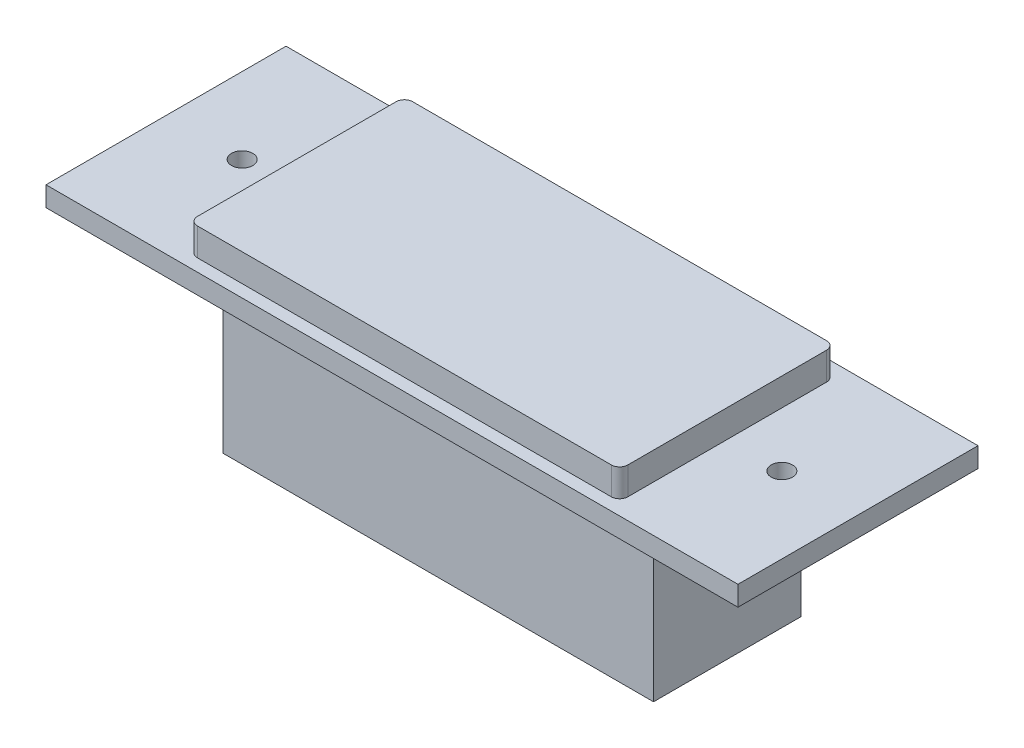
ISO-10303-21;
HEADER;
FILE_DESCRIPTION(('STEP AP214'),'2;1');
FILE_NAME('part.step','',(''),(''),'','','');
FILE_SCHEMA(('AUTOMOTIVE_DESIGN { 1 0 10303 214 1 1 1 1 }'));
ENDSEC;
DATA;
#1=APPLICATION_CONTEXT('core data for automotive mechanical design processes');
#2=APPLICATION_PROTOCOL_DEFINITION('international standard','automotive_design',2000,#1);
#3=PRODUCT_CONTEXT('',#1,'mechanical');
#4=PRODUCT('Part','Part','',(#3));
#5=PRODUCT_RELATED_PRODUCT_CATEGORY('part','',(#4));
#6=PRODUCT_DEFINITION_FORMATION('','',#4);
#7=PRODUCT_DEFINITION_CONTEXT('part definition',#1,'design');
#8=PRODUCT_DEFINITION('design','',#6,#7);
#9=PRODUCT_DEFINITION_SHAPE('','',#8);
#10=(LENGTH_UNIT() NAMED_UNIT(*) SI_UNIT(.MILLI.,.METRE.));
#11=(NAMED_UNIT(*) PLANE_ANGLE_UNIT() SI_UNIT($,.RADIAN.));
#12=(NAMED_UNIT(*) SI_UNIT($,.STERADIAN.) SOLID_ANGLE_UNIT());
#13=UNCERTAINTY_MEASURE_WITH_UNIT(LENGTH_MEASURE(1.E-05),#10,'distance_accuracy_value','');
#14=(GEOMETRIC_REPRESENTATION_CONTEXT(3) GLOBAL_UNCERTAINTY_ASSIGNED_CONTEXT((#13)) GLOBAL_UNIT_ASSIGNED_CONTEXT((#10,
#11,#12)) REPRESENTATION_CONTEXT('',''));
#15=CARTESIAN_POINT('',(0.,0.,0.));
#16=DIRECTION('',(0.,0.,1.));
#17=DIRECTION('',(1.,0.,0.));
#18=AXIS2_PLACEMENT_3D('',#15,#16,#17);
#19=CARTESIAN_POINT('',(0.,-3.048,0.));
#20=DIRECTION('',(0.,1.,0.));
#21=DIRECTION('',(0.,0.,1.));
#22=AXIS2_PLACEMENT_3D('',#19,#20,#21);
#23=PLANE('',#22);
#24=DIRECTION('',(0.,0.,-1.));
#25=VECTOR('',#24,1.);
#26=CARTESIAN_POINT('',(-53.086,-3.048,18.415));
#27=LINE('',#26,#25);
#28=CARTESIAN_POINT('',(-53.086,-3.048,18.415));
#29=VERTEX_POINT('',#28);
#30=CARTESIAN_POINT('',(-53.086,-3.048,-18.415));
#31=VERTEX_POINT('',#30);
#32=EDGE_CURVE('E191',#29,#31,#27,.T.);
#33=ORIENTED_EDGE('',*,*,#32,.T.);
#34=DIRECTION('',(1.,0.,0.));
#35=VECTOR('',#34,1.);
#36=CARTESIAN_POINT('',(53.086,-3.048,-18.415));
#37=LINE('',#36,#35);
#38=CARTESIAN_POINT('',(53.086,-3.048,-18.415));
#39=VERTEX_POINT('',#38);
#40=EDGE_CURVE('E194',#31,#39,#37,.T.);
#41=ORIENTED_EDGE('',*,*,#40,.T.);
#42=DIRECTION('',(0.,0.,1.));
#43=VECTOR('',#42,1.);
#44=CARTESIAN_POINT('',(53.086,-3.048,18.415));
#45=LINE('',#44,#43);
#46=CARTESIAN_POINT('',(53.086,-3.048,18.415));
#47=VERTEX_POINT('',#46);
#48=EDGE_CURVE('E197',#39,#47,#45,.T.);
#49=ORIENTED_EDGE('',*,*,#48,.T.);
#50=DIRECTION('',(-1.,0.,0.));
#51=VECTOR('',#50,1.);
#52=CARTESIAN_POINT('',(53.086,-3.048,18.415));
#53=LINE('',#52,#51);
#54=EDGE_CURVE('E199',#47,#29,#53,.T.);
#55=ORIENTED_EDGE('',*,*,#54,.T.);
#56=EDGE_LOOP('',(#33,#41,#49,#55));
#57=FACE_BOUND('',#56,.T.);
#58=CARTESIAN_POINT('',(41.402,-3.048,0.));
#59=DIRECTION('',(0.,1.,0.));
#60=DIRECTION('',(0.,0.,1.));
#61=AXIS2_PLACEMENT_3D('',#58,#59,#60);
#62=CIRCLE('',#61,1.63195);
#63=CARTESIAN_POINT('',(41.402,-3.048,1.63195));
#64=VERTEX_POINT('',#63);
#65=EDGE_CURVE('E187',#64,#64,#62,.T.);
#66=ORIENTED_EDGE('',*,*,#65,.T.);
#67=EDGE_LOOP('',(#66));
#68=FACE_BOUND('',#67,.T.);
#69=CARTESIAN_POINT('',(-41.402,-3.048,0.));
#70=DIRECTION('',(0.,1.,0.));
#71=DIRECTION('',(0.,0.,1.));
#72=AXIS2_PLACEMENT_3D('',#69,#70,#71);
#73=CIRCLE('',#72,1.63194999999999);
#74=CARTESIAN_POINT('',(-41.402,-3.048,1.63194999999999));
#75=VERTEX_POINT('',#74);
#76=EDGE_CURVE('E176',#75,#75,#73,.T.);
#77=ORIENTED_EDGE('',*,*,#76,.T.);
#78=EDGE_LOOP('',(#77));
#79=FACE_BOUND('',#78,.T.);
#80=DIRECTION('',(0.,0.,-1.));
#81=VECTOR('',#80,1.);
#82=CARTESIAN_POINT('',(-33.02,-3.048,11.303));
#83=LINE('',#82,#81);
#84=CARTESIAN_POINT('',(-33.02,-3.048,11.303));
#85=VERTEX_POINT('',#84);
#86=CARTESIAN_POINT('',(-33.02,-3.048,-11.303));
#87=VERTEX_POINT('',#86);
#88=EDGE_CURVE('E172',#85,#87,#83,.T.);
#89=ORIENTED_EDGE('',*,*,#88,.F.);
#90=DIRECTION('',(-1.,0.,0.));
#91=VECTOR('',#90,1.);
#92=CARTESIAN_POINT('',(33.02,-3.048,11.303));
#93=LINE('',#92,#91);
#94=CARTESIAN_POINT('',(33.02,-3.048,11.303));
#95=VERTEX_POINT('',#94);
#96=EDGE_CURVE('E169',#95,#85,#93,.T.);
#97=ORIENTED_EDGE('',*,*,#96,.F.);
#98=DIRECTION('',(0.,0.,1.));
#99=VECTOR('',#98,1.);
#100=CARTESIAN_POINT('',(33.02,-3.048,11.303));
#101=LINE('',#100,#99);
#102=CARTESIAN_POINT('',(33.02,-3.048,-11.303));
#103=VERTEX_POINT('',#102);
#104=EDGE_CURVE('E59',#103,#95,#101,.T.);
#105=ORIENTED_EDGE('',*,*,#104,.F.);
#106=DIRECTION('',(1.,0.,0.));
#107=VECTOR('',#106,1.);
#108=CARTESIAN_POINT('',(33.02,-3.048,-11.303));
#109=LINE('',#108,#107);
#110=EDGE_CURVE('E54',#87,#103,#109,.T.);
#111=ORIENTED_EDGE('',*,*,#110,.F.);
#112=EDGE_LOOP('',(#89,#97,#105,#111));
#113=FACE_BOUND('',#112,.T.);
#114=ADVANCED_FACE('F39',(#57,#68,#79,#113),#23,.F.);
#115=CARTESIAN_POINT('',(33.02,4.2418,-16.51));
#116=DIRECTION('',(-1.,0.,0.));
#117=DIRECTION('',(0.,0.,1.));
#118=AXIS2_PLACEMENT_3D('',#115,#116,#117);
#119=PLANE('',#118);
#120=DIRECTION('',(0.,0.,-1.));
#121=VECTOR('',#120,1.);
#122=CARTESIAN_POINT('',(33.02,4.2418,-16.51));
#123=LINE('',#122,#121);
#124=CARTESIAN_POINT('',(33.02,4.2418,15.24));
#125=VERTEX_POINT('',#124);
#126=CARTESIAN_POINT('',(33.02,4.2418,-15.24));
#127=VERTEX_POINT('',#126);
#128=EDGE_CURVE('E221',#125,#127,#123,.T.);
#129=ORIENTED_EDGE('',*,*,#128,.F.);
#130=DIRECTION('',(0.,-1.,0.));
#131=VECTOR('',#130,1.);
#132=CARTESIAN_POINT('',(33.02,4.2418,15.24));
#133=LINE('',#132,#131);
#134=CARTESIAN_POINT('',(33.02,0.,15.24));
#135=VERTEX_POINT('',#134);
#136=EDGE_CURVE('E243',#125,#135,#133,.T.);
#137=ORIENTED_EDGE('',*,*,#136,.T.);
#138=DIRECTION('',(0.,0.,-1.));
#139=VECTOR('',#138,1.);
#140=CARTESIAN_POINT('',(33.02,0.,-16.51));
#141=LINE('',#140,#139);
#142=CARTESIAN_POINT('',(33.02,0.,-15.24));
#143=VERTEX_POINT('',#142);
#144=EDGE_CURVE('E220',#135,#143,#141,.T.);
#145=ORIENTED_EDGE('',*,*,#144,.T.);
#146=DIRECTION('',(0.,-1.,0.));
#147=VECTOR('',#146,1.);
#148=CARTESIAN_POINT('',(33.02,4.2418,-15.24));
#149=LINE('',#148,#147);
#150=EDGE_CURVE('E234',#143,#127,#149,.F.);
#151=ORIENTED_EDGE('',*,*,#150,.T.);
#152=EDGE_LOOP('',(#129,#137,#145,#151));
#153=FACE_BOUND('',#152,.T.);
#154=ADVANCED_FACE('F301',(#153),#119,.F.);
#155=CARTESIAN_POINT('',(-33.02,4.2418,-16.51));
#156=DIRECTION('',(0.,0.,1.));
#157=DIRECTION('',(1.,0.,0.));
#158=AXIS2_PLACEMENT_3D('',#155,#156,#157);
#159=PLANE('',#158);
#160=DIRECTION('',(-1.,0.,0.));
#161=VECTOR('',#160,1.);
#162=CARTESIAN_POINT('',(-33.02,4.2418,-16.51));
#163=LINE('',#162,#161);
#164=CARTESIAN_POINT('',(31.75,4.2418,-16.51));
#165=VERTEX_POINT('',#164);
#166=CARTESIAN_POINT('',(-31.75,4.2418,-16.51));
#167=VERTEX_POINT('',#166);
#168=EDGE_CURVE('E224',#165,#167,#163,.T.);
#169=ORIENTED_EDGE('',*,*,#168,.F.);
#170=DIRECTION('',(0.,-1.,0.));
#171=VECTOR('',#170,1.);
#172=CARTESIAN_POINT('',(31.75,4.2418,-16.51));
#173=LINE('',#172,#171);
#174=CARTESIAN_POINT('',(31.75,0.,-16.51));
#175=VERTEX_POINT('',#174);
#176=EDGE_CURVE('E273',#165,#175,#173,.T.);
#177=ORIENTED_EDGE('',*,*,#176,.T.);
#178=DIRECTION('',(-1.,0.,0.));
#179=VECTOR('',#178,1.);
#180=CARTESIAN_POINT('',(-33.02,0.,-16.51));
#181=LINE('',#180,#179);
#182=CARTESIAN_POINT('',(-31.75,0.,-16.51));
#183=VERTEX_POINT('',#182);
#184=EDGE_CURVE('E237',#175,#183,#181,.T.);
#185=ORIENTED_EDGE('',*,*,#184,.T.);
#186=DIRECTION('',(0.,-1.,0.));
#187=VECTOR('',#186,1.);
#188=CARTESIAN_POINT('',(-31.75,4.2418,-16.51));
#189=LINE('',#188,#187);
#190=EDGE_CURVE('E271',#183,#167,#189,.F.);
#191=ORIENTED_EDGE('',*,*,#190,.T.);
#192=EDGE_LOOP('',(#169,#177,#185,#191));
#193=FACE_BOUND('',#192,.T.);
#194=ADVANCED_FACE('F309',(#193),#159,.F.);
#195=CARTESIAN_POINT('',(-33.02,4.2418,-16.51));
#196=DIRECTION('',(1.,0.,0.));
#197=DIRECTION('',(0.,0.,-1.));
#198=AXIS2_PLACEMENT_3D('',#195,#196,#197);
#199=PLANE('',#198);
#200=DIRECTION('',(0.,0.,1.));
#201=VECTOR('',#200,1.);
#202=CARTESIAN_POINT('',(-33.02,4.2418,-16.51));
#203=LINE('',#202,#201);
#204=CARTESIAN_POINT('',(-33.02,4.2418,-15.24));
#205=VERTEX_POINT('',#204);
#206=CARTESIAN_POINT('',(-33.02,4.2418,15.24));
#207=VERTEX_POINT('',#206);
#208=EDGE_CURVE('E228',#205,#207,#203,.T.);
#209=ORIENTED_EDGE('',*,*,#208,.F.);
#210=DIRECTION('',(0.,-1.,0.));
#211=VECTOR('',#210,1.);
#212=CARTESIAN_POINT('',(-33.02,4.2418,-15.24));
#213=LINE('',#212,#211);
#214=CARTESIAN_POINT('',(-33.02,0.,-15.24));
#215=VERTEX_POINT('',#214);
#216=EDGE_CURVE('E11',#205,#215,#213,.T.);
#217=ORIENTED_EDGE('',*,*,#216,.T.);
#218=DIRECTION('',(0.,0.,1.));
#219=VECTOR('',#218,1.);
#220=CARTESIAN_POINT('',(-33.02,0.,-16.51));
#221=LINE('',#220,#219);
#222=CARTESIAN_POINT('',(-33.02,0.,15.24));
#223=VERTEX_POINT('',#222);
#224=EDGE_CURVE('E239',#215,#223,#221,.T.);
#225=ORIENTED_EDGE('',*,*,#224,.T.);
#226=DIRECTION('',(0.,-1.,0.));
#227=VECTOR('',#226,1.);
#228=CARTESIAN_POINT('',(-33.02,4.2418,15.24));
#229=LINE('',#228,#227);
#230=EDGE_CURVE('E47',#223,#207,#229,.F.);
#231=ORIENTED_EDGE('',*,*,#230,.T.);
#232=EDGE_LOOP('',(#209,#217,#225,#231));
#233=FACE_BOUND('',#232,.T.);
#234=ADVANCED_FACE('F278',(#233),#199,.F.);
#235=CARTESIAN_POINT('',(-33.02,4.2418,16.51));
#236=DIRECTION('',(0.,0.,-1.));
#237=DIRECTION('',(-1.,0.,0.));
#238=AXIS2_PLACEMENT_3D('',#235,#236,#237);
#239=PLANE('',#238);
#240=DIRECTION('',(1.,0.,0.));
#241=VECTOR('',#240,1.);
#242=CARTESIAN_POINT('',(-33.02,0.,16.51));
#243=LINE('',#242,#241);
#244=CARTESIAN_POINT('',(-31.75,0.,16.51));
#245=VERTEX_POINT('',#244);
#246=CARTESIAN_POINT('',(31.75,0.,16.51));
#247=VERTEX_POINT('',#246);
#248=EDGE_CURVE('E225',#245,#247,#243,.T.);
#249=ORIENTED_EDGE('',*,*,#248,.T.);
#250=DIRECTION('',(0.,-1.,0.));
#251=VECTOR('',#250,1.);
#252=CARTESIAN_POINT('',(31.75,4.2418,16.51));
#253=LINE('',#252,#251);
#254=CARTESIAN_POINT('',(31.75,4.2418,16.51));
#255=VERTEX_POINT('',#254);
#256=EDGE_CURVE('E261',#247,#255,#253,.F.);
#257=ORIENTED_EDGE('',*,*,#256,.T.);
#258=DIRECTION('',(1.,0.,0.));
#259=VECTOR('',#258,1.);
#260=CARTESIAN_POINT('',(-33.02,4.2418,16.51));
#261=LINE('',#260,#259);
#262=CARTESIAN_POINT('',(-31.75,4.2418,16.51));
#263=VERTEX_POINT('',#262);
#264=EDGE_CURVE('E231',#263,#255,#261,.T.);
#265=ORIENTED_EDGE('',*,*,#264,.F.);
#266=DIRECTION('',(0.,-1.,0.));
#267=VECTOR('',#266,1.);
#268=CARTESIAN_POINT('',(-31.75,4.2418,16.51));
#269=LINE('',#268,#267);
#270=EDGE_CURVE('E258',#263,#245,#269,.T.);
#271=ORIENTED_EDGE('',*,*,#270,.T.);
#272=EDGE_LOOP('',(#249,#257,#265,#271));
#273=FACE_BOUND('',#272,.T.);
#274=ADVANCED_FACE('F290',(#273),#239,.F.);
#275=CARTESIAN_POINT('',(0.,4.2418,0.));
#276=DIRECTION('',(0.,1.,0.));
#277=DIRECTION('',(0.,0.,1.));
#278=AXIS2_PLACEMENT_3D('',#275,#276,#277);
#279=PLANE('',#278);
#280=ORIENTED_EDGE('',*,*,#264,.T.);
#281=CARTESIAN_POINT('',(31.75,4.2418,15.24));
#282=DIRECTION('',(0.,1.,0.));
#283=DIRECTION('',(0.,0.,1.));
#284=AXIS2_PLACEMENT_3D('',#281,#282,#283);
#285=CIRCLE('',#284,1.27);
#286=EDGE_CURVE('E269',#255,#125,#285,.T.);
#287=ORIENTED_EDGE('',*,*,#286,.T.);
#288=ORIENTED_EDGE('',*,*,#128,.T.);
#289=CARTESIAN_POINT('',(31.75,4.2418,-15.24));
#290=DIRECTION('',(0.,1.,0.));
#291=DIRECTION('',(0.,0.,1.));
#292=AXIS2_PLACEMENT_3D('',#289,#290,#291);
#293=CIRCLE('',#292,1.27);
#294=EDGE_CURVE('E267',#127,#165,#293,.T.);
#295=ORIENTED_EDGE('',*,*,#294,.T.);
#296=ORIENTED_EDGE('',*,*,#168,.T.);
#297=CARTESIAN_POINT('',(-31.75,4.2418,-15.24));
#298=DIRECTION('',(0.,1.,0.));
#299=DIRECTION('',(0.,0.,1.));
#300=AXIS2_PLACEMENT_3D('',#297,#298,#299);
#301=CIRCLE('',#300,1.27);
#302=EDGE_CURVE('E265',#167,#205,#301,.T.);
#303=ORIENTED_EDGE('',*,*,#302,.T.);
#304=ORIENTED_EDGE('',*,*,#208,.T.);
#305=CARTESIAN_POINT('',(-31.75,4.2418,15.24));
#306=DIRECTION('',(0.,1.,0.));
#307=DIRECTION('',(0.,0.,1.));
#308=AXIS2_PLACEMENT_3D('',#305,#306,#307);
#309=CIRCLE('',#308,1.27);
#310=EDGE_CURVE('E263',#207,#263,#309,.T.);
#311=ORIENTED_EDGE('',*,*,#310,.T.);
#312=EDGE_LOOP('',(#280,#287,#288,#295,#296,#303,#304,#311));
#313=FACE_BOUND('',#312,.T.);
#314=ADVANCED_FACE('F284',(#313),#279,.T.);
#315=CARTESIAN_POINT('',(31.75,4.2418,15.24));
#316=DIRECTION('',(0.,-1.,0.));
#317=DIRECTION('',(0.,0.,-1.));
#318=AXIS2_PLACEMENT_3D('',#315,#316,#317);
#319=CYLINDRICAL_SURFACE('',#318,1.27);
#320=ORIENTED_EDGE('',*,*,#286,.F.);
#321=ORIENTED_EDGE('',*,*,#256,.F.);
#322=CARTESIAN_POINT('',(31.75,0.,15.24));
#323=DIRECTION('',(0.,1.,0.));
#324=DIRECTION('',(0.,0.,1.));
#325=AXIS2_PLACEMENT_3D('',#322,#323,#324);
#326=CIRCLE('',#325,1.27);
#327=EDGE_CURVE('E255',#135,#247,#326,.F.);
#328=ORIENTED_EDGE('',*,*,#327,.F.);
#329=ORIENTED_EDGE('',*,*,#136,.F.);
#330=EDGE_LOOP('',(#320,#321,#328,#329));
#331=FACE_BOUND('',#330,.T.);
#332=ADVANCED_FACE('F298',(#331),#319,.T.);
#333=CARTESIAN_POINT('',(31.75,4.2418,-15.24));
#334=DIRECTION('',(0.,-1.,0.));
#335=DIRECTION('',(0.,0.,-1.));
#336=AXIS2_PLACEMENT_3D('',#333,#334,#335);
#337=CYLINDRICAL_SURFACE('',#336,1.27);
#338=ORIENTED_EDGE('',*,*,#294,.F.);
#339=ORIENTED_EDGE('',*,*,#150,.F.);
#340=CARTESIAN_POINT('',(31.75,0.,-15.24));
#341=DIRECTION('',(0.,1.,0.));
#342=DIRECTION('',(0.,0.,1.));
#343=AXIS2_PLACEMENT_3D('',#340,#341,#342);
#344=CIRCLE('',#343,1.27);
#345=EDGE_CURVE('E252',#175,#143,#344,.F.);
#346=ORIENTED_EDGE('',*,*,#345,.F.);
#347=ORIENTED_EDGE('',*,*,#176,.F.);
#348=EDGE_LOOP('',(#338,#339,#346,#347));
#349=FACE_BOUND('',#348,.T.);
#350=ADVANCED_FACE('F306',(#349),#337,.T.);
#351=CARTESIAN_POINT('',(-31.75,4.2418,-15.24));
#352=DIRECTION('',(0.,-1.,0.));
#353=DIRECTION('',(0.,0.,-1.));
#354=AXIS2_PLACEMENT_3D('',#351,#352,#353);
#355=CYLINDRICAL_SURFACE('',#354,1.27);
#356=ORIENTED_EDGE('',*,*,#302,.F.);
#357=ORIENTED_EDGE('',*,*,#190,.F.);
#358=CARTESIAN_POINT('',(-31.75,0.,-15.24));
#359=DIRECTION('',(0.,1.,0.));
#360=DIRECTION('',(0.,0.,1.));
#361=AXIS2_PLACEMENT_3D('',#358,#359,#360);
#362=CIRCLE('',#361,1.27);
#363=EDGE_CURVE('E249',#215,#183,#362,.F.);
#364=ORIENTED_EDGE('',*,*,#363,.F.);
#365=ORIENTED_EDGE('',*,*,#216,.F.);
#366=EDGE_LOOP('',(#356,#357,#364,#365));
#367=FACE_BOUND('',#366,.T.);
#368=ADVANCED_FACE('F312',(#367),#355,.T.);
#369=CARTESIAN_POINT('',(-31.75,4.2418,15.24));
#370=DIRECTION('',(0.,-1.,0.));
#371=DIRECTION('',(0.,0.,-1.));
#372=AXIS2_PLACEMENT_3D('',#369,#370,#371);
#373=CYLINDRICAL_SURFACE('',#372,1.27);
#374=ORIENTED_EDGE('',*,*,#310,.F.);
#375=ORIENTED_EDGE('',*,*,#230,.F.);
#376=CARTESIAN_POINT('',(-31.75,0.,15.24));
#377=DIRECTION('',(0.,1.,0.));
#378=DIRECTION('',(0.,0.,1.));
#379=AXIS2_PLACEMENT_3D('',#376,#377,#378);
#380=CIRCLE('',#379,1.27);
#381=EDGE_CURVE('E246',#245,#223,#380,.F.);
#382=ORIENTED_EDGE('',*,*,#381,.F.);
#383=ORIENTED_EDGE('',*,*,#270,.F.);
#384=EDGE_LOOP('',(#374,#375,#382,#383));
#385=FACE_BOUND('',#384,.T.);
#386=ADVANCED_FACE('F41',(#385),#373,.T.);
#387=CARTESIAN_POINT('',(0.,0.,0.));
#388=DIRECTION('',(0.,1.,0.));
#389=DIRECTION('',(0.,0.,1.));
#390=AXIS2_PLACEMENT_3D('',#387,#388,#389);
#391=PLANE('',#390);
#392=CARTESIAN_POINT('',(-41.402,0.,0.));
#393=DIRECTION('',(0.,1.,0.));
#394=DIRECTION('',(0.,0.,1.));
#395=AXIS2_PLACEMENT_3D('',#392,#393,#394);
#396=CIRCLE('',#395,1.63195);
#397=CARTESIAN_POINT('',(-41.402,0.,1.63195));
#398=VERTEX_POINT('',#397);
#399=EDGE_CURVE('E173',#398,#398,#396,.T.);
#400=ORIENTED_EDGE('',*,*,#399,.F.);
#401=EDGE_LOOP('',(#400));
#402=FACE_BOUND('',#401,.T.);
#403=CARTESIAN_POINT('',(41.402,0.,0.));
#404=DIRECTION('',(0.,1.,0.));
#405=DIRECTION('',(0.,0.,1.));
#406=AXIS2_PLACEMENT_3D('',#403,#404,#405);
#407=CIRCLE('',#406,1.63195);
#408=CARTESIAN_POINT('',(41.402,0.,1.63195));
#409=VERTEX_POINT('',#408);
#410=EDGE_CURVE('E184',#409,#409,#407,.T.);
#411=ORIENTED_EDGE('',*,*,#410,.F.);
#412=EDGE_LOOP('',(#411));
#413=FACE_BOUND('',#412,.T.);
#414=DIRECTION('',(0.,0.,-1.));
#415=VECTOR('',#414,1.);
#416=CARTESIAN_POINT('',(-53.086,0.,18.415));
#417=LINE('',#416,#415);
#418=CARTESIAN_POINT('',(-53.086,0.,18.415));
#419=VERTEX_POINT('',#418);
#420=CARTESIAN_POINT('',(-53.086,0.,-18.415));
#421=VERTEX_POINT('',#420);
#422=EDGE_CURVE('E190',#419,#421,#417,.T.);
#423=ORIENTED_EDGE('',*,*,#422,.F.);
#424=DIRECTION('',(-1.,0.,0.));
#425=VECTOR('',#424,1.);
#426=CARTESIAN_POINT('',(53.086,0.,18.415));
#427=LINE('',#426,#425);
#428=CARTESIAN_POINT('',(53.086,0.,18.415));
#429=VERTEX_POINT('',#428);
#430=EDGE_CURVE('E195',#429,#419,#427,.T.);
#431=ORIENTED_EDGE('',*,*,#430,.F.);
#432=DIRECTION('',(0.,0.,1.));
#433=VECTOR('',#432,1.);
#434=CARTESIAN_POINT('',(53.086,0.,18.415));
#435=LINE('',#434,#433);
#436=CARTESIAN_POINT('',(53.086,0.,-18.415));
#437=VERTEX_POINT('',#436);
#438=EDGE_CURVE('E206',#437,#429,#435,.T.);
#439=ORIENTED_EDGE('',*,*,#438,.F.);
#440=DIRECTION('',(1.,0.,0.));
#441=VECTOR('',#440,1.);
#442=CARTESIAN_POINT('',(53.086,0.,-18.415));
#443=LINE('',#442,#441);
#444=EDGE_CURVE('E204',#421,#437,#443,.T.);
#445=ORIENTED_EDGE('',*,*,#444,.F.);
#446=EDGE_LOOP('',(#423,#431,#439,#445));
#447=FACE_BOUND('',#446,.T.);
#448=ORIENTED_EDGE('',*,*,#144,.F.);
#449=ORIENTED_EDGE('',*,*,#327,.T.);
#450=ORIENTED_EDGE('',*,*,#248,.F.);
#451=ORIENTED_EDGE('',*,*,#381,.T.);
#452=ORIENTED_EDGE('',*,*,#224,.F.);
#453=ORIENTED_EDGE('',*,*,#363,.T.);
#454=ORIENTED_EDGE('',*,*,#184,.F.);
#455=ORIENTED_EDGE('',*,*,#345,.T.);
#456=EDGE_LOOP('',(#448,#449,#450,#451,#452,#453,#454,#455));
#457=FACE_BOUND('',#456,.T.);
#458=ADVANCED_FACE('F294',(#402,#413,#447,#457),#391,.T.);
#459=CARTESIAN_POINT('',(-53.086,-3.048,18.415));
#460=DIRECTION('',(1.,0.,0.));
#461=DIRECTION('',(0.,0.,-1.));
#462=AXIS2_PLACEMENT_3D('',#459,#460,#461);
#463=PLANE('',#462);
#464=ORIENTED_EDGE('',*,*,#422,.T.);
#465=DIRECTION('',(0.,1.,0.));
#466=VECTOR('',#465,1.);
#467=CARTESIAN_POINT('',(-53.086,-3.048,-18.415));
#468=LINE('',#467,#466);
#469=EDGE_CURVE('E217',#31,#421,#468,.T.);
#470=ORIENTED_EDGE('',*,*,#469,.F.);
#471=ORIENTED_EDGE('',*,*,#32,.F.);
#472=DIRECTION('',(0.,1.,0.));
#473=VECTOR('',#472,1.);
#474=CARTESIAN_POINT('',(-53.086,-3.048,18.415));
#475=LINE('',#474,#473);
#476=EDGE_CURVE('E201',#29,#419,#475,.T.);
#477=ORIENTED_EDGE('',*,*,#476,.T.);
#478=EDGE_LOOP('',(#464,#470,#471,#477));
#479=FACE_BOUND('',#478,.T.);
#480=ADVANCED_FACE('F335',(#479),#463,.F.);
#481=CARTESIAN_POINT('',(53.086,-3.048,-18.415));
#482=DIRECTION('',(0.,0.,1.));
#483=DIRECTION('',(1.,0.,0.));
#484=AXIS2_PLACEMENT_3D('',#481,#482,#483);
#485=PLANE('',#484);
#486=ORIENTED_EDGE('',*,*,#444,.T.);
#487=DIRECTION('',(0.,1.,0.));
#488=VECTOR('',#487,1.);
#489=CARTESIAN_POINT('',(53.086,-3.048,-18.415));
#490=LINE('',#489,#488);
#491=EDGE_CURVE('E214',#39,#437,#490,.T.);
#492=ORIENTED_EDGE('',*,*,#491,.F.);
#493=ORIENTED_EDGE('',*,*,#40,.F.);
#494=ORIENTED_EDGE('',*,*,#469,.T.);
#495=EDGE_LOOP('',(#486,#492,#493,#494));
#496=FACE_BOUND('',#495,.T.);
#497=ADVANCED_FACE('F344',(#496),#485,.F.);
#498=CARTESIAN_POINT('',(53.086,-3.048,18.415));
#499=DIRECTION('',(-1.,0.,0.));
#500=DIRECTION('',(0.,0.,1.));
#501=AXIS2_PLACEMENT_3D('',#498,#499,#500);
#502=PLANE('',#501);
#503=ORIENTED_EDGE('',*,*,#438,.T.);
#504=DIRECTION('',(0.,1.,0.));
#505=VECTOR('',#504,1.);
#506=CARTESIAN_POINT('',(53.086,-3.048,18.415));
#507=LINE('',#506,#505);
#508=EDGE_CURVE('E211',#47,#429,#507,.T.);
#509=ORIENTED_EDGE('',*,*,#508,.F.);
#510=ORIENTED_EDGE('',*,*,#48,.F.);
#511=ORIENTED_EDGE('',*,*,#491,.T.);
#512=EDGE_LOOP('',(#503,#509,#510,#511));
#513=FACE_BOUND('',#512,.T.);
#514=ADVANCED_FACE('F340',(#513),#502,.F.);
#515=CARTESIAN_POINT('',(53.086,-3.048,18.415));
#516=DIRECTION('',(0.,0.,-1.));
#517=DIRECTION('',(-1.,0.,0.));
#518=AXIS2_PLACEMENT_3D('',#515,#516,#517);
#519=PLANE('',#518);
#520=ORIENTED_EDGE('',*,*,#430,.T.);
#521=ORIENTED_EDGE('',*,*,#476,.F.);
#522=ORIENTED_EDGE('',*,*,#54,.F.);
#523=ORIENTED_EDGE('',*,*,#508,.T.);
#524=EDGE_LOOP('',(#520,#521,#522,#523));
#525=FACE_BOUND('',#524,.T.);
#526=ADVANCED_FACE('F337',(#525),#519,.F.);
#527=CARTESIAN_POINT('',(41.402,0.,0.));
#528=DIRECTION('',(0.,1.,0.));
#529=DIRECTION('',(0.,0.,1.));
#530=AXIS2_PLACEMENT_3D('',#527,#528,#529);
#531=CYLINDRICAL_SURFACE('',#530,1.63195);
#532=ORIENTED_EDGE('',*,*,#65,.F.);
#533=EDGE_LOOP('',(#532));
#534=FACE_BOUND('',#533,.T.);
#535=ORIENTED_EDGE('',*,*,#410,.T.);
#536=EDGE_LOOP('',(#535));
#537=FACE_BOUND('',#536,.T.);
#538=ADVANCED_FACE('F331',(#534,#537),#531,.F.);
#539=CARTESIAN_POINT('',(-41.402,0.,0.));
#540=DIRECTION('',(0.,1.,0.));
#541=DIRECTION('',(0.,0.,1.));
#542=AXIS2_PLACEMENT_3D('',#539,#540,#541);
#543=CYLINDRICAL_SURFACE('',#542,1.63195);
#544=ORIENTED_EDGE('',*,*,#76,.F.);
#545=EDGE_LOOP('',(#544));
#546=FACE_BOUND('',#545,.T.);
#547=ORIENTED_EDGE('',*,*,#399,.T.);
#548=EDGE_LOOP('',(#547));
#549=FACE_BOUND('',#548,.T.);
#550=ADVANCED_FACE('F418',(#546,#549),#543,.F.);
#551=CARTESIAN_POINT('',(-33.02,-29.21,11.303));
#552=DIRECTION('',(1.,0.,0.));
#553=DIRECTION('',(0.,0.,-1.));
#554=AXIS2_PLACEMENT_3D('',#551,#552,#553);
#555=PLANE('',#554);
#556=ORIENTED_EDGE('',*,*,#88,.T.);
#557=DIRECTION('',(0.,1.,0.));
#558=VECTOR('',#557,1.);
#559=CARTESIAN_POINT('',(-33.02,-29.21,-11.303));
#560=LINE('',#559,#558);
#561=CARTESIAN_POINT('',(-33.02,-29.21,-11.303));
#562=VERTEX_POINT('',#561);
#563=EDGE_CURVE('E153',#562,#87,#560,.T.);
#564=ORIENTED_EDGE('',*,*,#563,.F.);
#565=DIRECTION('',(0.,0.,-1.));
#566=VECTOR('',#565,1.);
#567=CARTESIAN_POINT('',(-33.02,-29.21,11.303));
#568=LINE('',#567,#566);
#569=CARTESIAN_POINT('',(-33.02,-29.21,11.303));
#570=VERTEX_POINT('',#569);
#571=EDGE_CURVE('E160',#570,#562,#568,.T.);
#572=ORIENTED_EDGE('',*,*,#571,.F.);
#573=DIRECTION('',(0.,1.,0.));
#574=VECTOR('',#573,1.);
#575=CARTESIAN_POINT('',(-33.02,-29.21,11.303));
#576=LINE('',#575,#574);
#577=EDGE_CURVE('E479',#570,#85,#576,.T.);
#578=ORIENTED_EDGE('',*,*,#577,.T.);
#579=EDGE_LOOP('',(#556,#564,#572,#578));
#580=FACE_BOUND('',#579,.T.);
#581=ADVANCED_FACE('F171',(#580),#555,.F.);
#582=CARTESIAN_POINT('',(33.02,-29.21,-11.303));
#583=DIRECTION('',(0.,0.,1.));
#584=DIRECTION('',(1.,0.,0.));
#585=AXIS2_PLACEMENT_3D('',#582,#583,#584);
#586=PLANE('',#585);
#587=ORIENTED_EDGE('',*,*,#110,.T.);
#588=DIRECTION('',(0.,1.,0.));
#589=VECTOR('',#588,1.);
#590=CARTESIAN_POINT('',(33.02,-29.21,-11.303));
#591=LINE('',#590,#589);
#592=CARTESIAN_POINT('',(33.02,-29.21,-11.303));
#593=VERTEX_POINT('',#592);
#594=EDGE_CURVE('E156',#593,#103,#591,.T.);
#595=ORIENTED_EDGE('',*,*,#594,.F.);
#596=DIRECTION('',(1.,0.,0.));
#597=VECTOR('',#596,1.);
#598=CARTESIAN_POINT('',(33.02,-29.21,-11.303));
#599=LINE('',#598,#597);
#600=EDGE_CURVE('E149',#562,#593,#599,.T.);
#601=ORIENTED_EDGE('',*,*,#600,.F.);
#602=ORIENTED_EDGE('',*,*,#563,.T.);
#603=EDGE_LOOP('',(#587,#595,#601,#602));
#604=FACE_BOUND('',#603,.T.);
#605=ADVANCED_FACE('F151',(#604),#586,.F.);
#606=CARTESIAN_POINT('',(33.02,-29.21,11.303));
#607=DIRECTION('',(-1.,0.,0.));
#608=DIRECTION('',(0.,0.,1.));
#609=AXIS2_PLACEMENT_3D('',#606,#607,#608);
#610=PLANE('',#609);
#611=ORIENTED_EDGE('',*,*,#104,.T.);
#612=DIRECTION('',(0.,1.,0.));
#613=VECTOR('',#612,1.);
#614=CARTESIAN_POINT('',(33.02,-29.21,11.303));
#615=LINE('',#614,#613);
#616=CARTESIAN_POINT('',(33.02,-29.21,11.303));
#617=VERTEX_POINT('',#616);
#618=EDGE_CURVE('E178',#617,#95,#615,.T.);
#619=ORIENTED_EDGE('',*,*,#618,.F.);
#620=DIRECTION('',(0.,0.,1.));
#621=VECTOR('',#620,1.);
#622=CARTESIAN_POINT('',(33.02,-29.21,11.303));
#623=LINE('',#622,#621);
#624=EDGE_CURVE('E159',#593,#617,#623,.T.);
#625=ORIENTED_EDGE('',*,*,#624,.F.);
#626=ORIENTED_EDGE('',*,*,#594,.T.);
#627=EDGE_LOOP('',(#611,#619,#625,#626));
#628=FACE_BOUND('',#627,.T.);
#629=ADVANCED_FACE('F443',(#628),#610,.F.);
#630=CARTESIAN_POINT('',(33.02,-29.21,11.303));
#631=DIRECTION('',(0.,0.,-1.));
#632=DIRECTION('',(-1.,0.,0.));
#633=AXIS2_PLACEMENT_3D('',#630,#631,#632);
#634=PLANE('',#633);
#635=ORIENTED_EDGE('',*,*,#96,.T.);
#636=ORIENTED_EDGE('',*,*,#577,.F.);
#637=DIRECTION('',(-1.,0.,0.));
#638=VECTOR('',#637,1.);
#639=CARTESIAN_POINT('',(33.02,-29.21,11.303));
#640=LINE('',#639,#638);
#641=EDGE_CURVE('E165',#617,#570,#640,.T.);
#642=ORIENTED_EDGE('',*,*,#641,.F.);
#643=ORIENTED_EDGE('',*,*,#618,.T.);
#644=EDGE_LOOP('',(#635,#636,#642,#643));
#645=FACE_BOUND('',#644,.T.);
#646=ADVANCED_FACE('F450',(#645),#634,.F.);
#647=CARTESIAN_POINT('',(0.,-29.21,0.));
#648=DIRECTION('',(0.,1.,0.));
#649=DIRECTION('',(0.,0.,1.));
#650=AXIS2_PLACEMENT_3D('',#647,#648,#649);
#651=PLANE('',#650);
#652=ORIENTED_EDGE('',*,*,#571,.T.);
#653=ORIENTED_EDGE('',*,*,#600,.T.);
#654=ORIENTED_EDGE('',*,*,#624,.T.);
#655=ORIENTED_EDGE('',*,*,#641,.T.);
#656=EDGE_LOOP('',(#652,#653,#654,#655));
#657=FACE_BOUND('',#656,.T.);
#658=ADVANCED_FACE('F163',(#657),#651,.F.);
#659=CLOSED_SHELL('',(#114,#154,#194,#234,#274,#314,#332,#350,#368,#386,#458,#480,#497,#514,
#526,#538,#550,#581,#605,#629,#646,#658));
#660=MANIFOLD_SOLID_BREP('B2',#659);
#661=ADVANCED_BREP_SHAPE_REPRESENTATION('',(#18,#660),#14);
#662=SHAPE_DEFINITION_REPRESENTATION(#9,#661);
ENDSEC;
END-ISO-10303-21;
